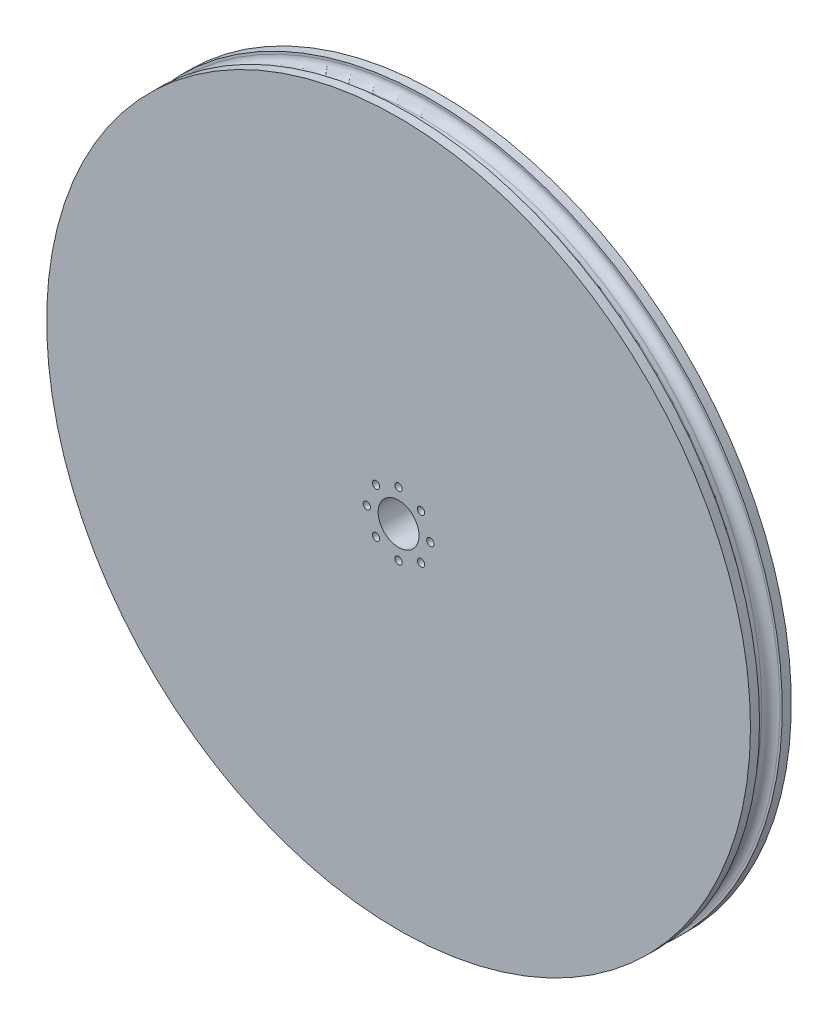
ISO-10303-21;
HEADER;
FILE_DESCRIPTION(('STEP AP214'),'2;1');
FILE_NAME('part.step','',(''),(''),'','','');
FILE_SCHEMA(('AUTOMOTIVE_DESIGN { 1 0 10303 214 1 1 1 1 }'));
ENDSEC;
DATA;
#1=APPLICATION_CONTEXT('core data for automotive mechanical design processes');
#2=APPLICATION_PROTOCOL_DEFINITION('international standard','automotive_design',2000,#1);
#3=PRODUCT_CONTEXT('',#1,'mechanical');
#4=PRODUCT('Part','Part','',(#3));
#5=PRODUCT_RELATED_PRODUCT_CATEGORY('part','',(#4));
#6=PRODUCT_DEFINITION_FORMATION('','',#4);
#7=PRODUCT_DEFINITION_CONTEXT('part definition',#1,'design');
#8=PRODUCT_DEFINITION('design','',#6,#7);
#9=PRODUCT_DEFINITION_SHAPE('','',#8);
#10=(LENGTH_UNIT() NAMED_UNIT(*) SI_UNIT(.MILLI.,.METRE.));
#11=(NAMED_UNIT(*) PLANE_ANGLE_UNIT() SI_UNIT($,.RADIAN.));
#12=(NAMED_UNIT(*) SI_UNIT($,.STERADIAN.) SOLID_ANGLE_UNIT());
#13=UNCERTAINTY_MEASURE_WITH_UNIT(LENGTH_MEASURE(1.E-05),#10,'distance_accuracy_value','');
#14=(GEOMETRIC_REPRESENTATION_CONTEXT(3) GLOBAL_UNCERTAINTY_ASSIGNED_CONTEXT((#13)) GLOBAL_UNIT_ASSIGNED_CONTEXT((#10,
#11,#12)) REPRESENTATION_CONTEXT('',''));
#15=CARTESIAN_POINT('',(0.,0.,0.));
#16=DIRECTION('',(0.,0.,1.));
#17=DIRECTION('',(1.,0.,0.));
#18=AXIS2_PLACEMENT_3D('',#15,#16,#17);
#19=CARTESIAN_POINT('',(-4.94974746830586,4.9497474683058,7.));
#20=DIRECTION('',(0.,0.,-1.));
#21=DIRECTION('',(-1.,0.,0.));
#22=AXIS2_PLACEMENT_3D('',#19,#20,#21);
#23=CYLINDRICAL_SURFACE('',#22,0.799999999999999);
#24=CARTESIAN_POINT('',(-4.94974746830586,4.9497474683058,7.));
#25=DIRECTION('',(0.,0.,-1.));
#26=DIRECTION('',(-1.,0.,0.));
#27=AXIS2_PLACEMENT_3D('',#24,#25,#26);
#28=CIRCLE('',#27,0.799999999999999);
#29=CARTESIAN_POINT('',(-5.74974746830586,4.9497474683058,7.));
#30=VERTEX_POINT('',#29);
#31=EDGE_CURVE('E81',#30,#30,#28,.T.);
#32=ORIENTED_EDGE('',*,*,#31,.F.);
#33=EDGE_LOOP('',(#32));
#34=FACE_BOUND('',#33,.T.);
#35=CARTESIAN_POINT('',(-4.94974746830586,4.9497474683058,0.5));
#36=DIRECTION('',(0.,0.,-1.));
#37=DIRECTION('',(-1.,0.,0.));
#38=AXIS2_PLACEMENT_3D('',#35,#36,#37);
#39=CIRCLE('',#38,0.799999999999999);
#40=CARTESIAN_POINT('',(-5.74974746830586,4.9497474683058,0.5));
#41=VERTEX_POINT('',#40);
#42=EDGE_CURVE('E95',#41,#41,#39,.F.);
#43=ORIENTED_EDGE('',*,*,#42,.F.);
#44=EDGE_LOOP('',(#43));
#45=FACE_BOUND('',#44,.T.);
#46=ADVANCED_FACE('F33',(#34,#45),#23,.F.);
#47=CARTESIAN_POINT('',(-7.,0.,7.));
#48=DIRECTION('',(0.,0.,-1.));
#49=DIRECTION('',(-1.,0.,0.));
#50=AXIS2_PLACEMENT_3D('',#47,#48,#49);
#51=CYLINDRICAL_SURFACE('',#50,0.800000000000002);
#52=CARTESIAN_POINT('',(-7.,0.,7.));
#53=DIRECTION('',(0.,0.,-1.));
#54=DIRECTION('',(-1.,0.,0.));
#55=AXIS2_PLACEMENT_3D('',#52,#53,#54);
#56=CIRCLE('',#55,0.800000000000002);
#57=CARTESIAN_POINT('',(-7.8,0.,7.));
#58=VERTEX_POINT('',#57);
#59=EDGE_CURVE('E78',#58,#58,#56,.T.);
#60=ORIENTED_EDGE('',*,*,#59,.F.);
#61=EDGE_LOOP('',(#60));
#62=FACE_BOUND('',#61,.T.);
#63=CARTESIAN_POINT('',(-7.,0.,0.5));
#64=DIRECTION('',(0.,0.,-1.));
#65=DIRECTION('',(-1.,0.,0.));
#66=AXIS2_PLACEMENT_3D('',#63,#64,#65);
#67=CIRCLE('',#66,0.800000000000002);
#68=CARTESIAN_POINT('',(-7.8,0.,0.5));
#69=VERTEX_POINT('',#68);
#70=EDGE_CURVE('E100',#69,#69,#67,.F.);
#71=ORIENTED_EDGE('',*,*,#70,.F.);
#72=EDGE_LOOP('',(#71));
#73=FACE_BOUND('',#72,.T.);
#74=ADVANCED_FACE('F157',(#62,#73),#51,.F.);
#75=CARTESIAN_POINT('',(-4.94974746830579,-4.94974746830588,7.));
#76=DIRECTION('',(0.,0.,-1.));
#77=DIRECTION('',(-1.,0.,0.));
#78=AXIS2_PLACEMENT_3D('',#75,#76,#77);
#79=CYLINDRICAL_SURFACE('',#78,0.799999999999999);
#80=CARTESIAN_POINT('',(-4.94974746830579,-4.94974746830588,7.));
#81=DIRECTION('',(0.,0.,-1.));
#82=DIRECTION('',(-1.,0.,0.));
#83=AXIS2_PLACEMENT_3D('',#80,#81,#82);
#84=CIRCLE('',#83,0.799999999999999);
#85=CARTESIAN_POINT('',(-5.74974746830579,-4.94974746830588,7.));
#86=VERTEX_POINT('',#85);
#87=EDGE_CURVE('E74',#86,#86,#84,.T.);
#88=ORIENTED_EDGE('',*,*,#87,.F.);
#89=EDGE_LOOP('',(#88));
#90=FACE_BOUND('',#89,.T.);
#91=CARTESIAN_POINT('',(-4.94974746830579,-4.94974746830588,0.5));
#92=DIRECTION('',(0.,0.,-1.));
#93=DIRECTION('',(-1.,0.,0.));
#94=AXIS2_PLACEMENT_3D('',#91,#92,#93);
#95=CIRCLE('',#94,0.799999999999999);
#96=CARTESIAN_POINT('',(-5.74974746830579,-4.94974746830588,0.5));
#97=VERTEX_POINT('',#96);
#98=EDGE_CURVE('E103',#97,#97,#95,.F.);
#99=ORIENTED_EDGE('',*,*,#98,.F.);
#100=EDGE_LOOP('',(#99));
#101=FACE_BOUND('',#100,.T.);
#102=ADVANCED_FACE('F163',(#90,#101),#79,.F.);
#103=CARTESIAN_POINT('',(0.,-7.,7.));
#104=DIRECTION('',(0.,0.,-1.));
#105=DIRECTION('',(-1.,0.,0.));
#106=AXIS2_PLACEMENT_3D('',#103,#104,#105);
#107=CYLINDRICAL_SURFACE('',#106,0.8);
#108=CARTESIAN_POINT('',(0.,-7.,7.));
#109=DIRECTION('',(0.,0.,-1.));
#110=DIRECTION('',(-1.,0.,0.));
#111=AXIS2_PLACEMENT_3D('',#108,#109,#110);
#112=CIRCLE('',#111,0.8);
#113=CARTESIAN_POINT('',(-0.799999999999931,-7.,7.));
#114=VERTEX_POINT('',#113);
#115=EDGE_CURVE('E71',#114,#114,#112,.T.);
#116=ORIENTED_EDGE('',*,*,#115,.F.);
#117=EDGE_LOOP('',(#116));
#118=FACE_BOUND('',#117,.T.);
#119=CARTESIAN_POINT('',(0.,-7.,0.5));
#120=DIRECTION('',(0.,0.,-1.));
#121=DIRECTION('',(-1.,0.,0.));
#122=AXIS2_PLACEMENT_3D('',#119,#120,#121);
#123=CIRCLE('',#122,0.8);
#124=CARTESIAN_POINT('',(-0.799999999999931,-7.,0.5));
#125=VERTEX_POINT('',#124);
#126=EDGE_CURVE('E106',#125,#125,#123,.F.);
#127=ORIENTED_EDGE('',*,*,#126,.F.);
#128=EDGE_LOOP('',(#127));
#129=FACE_BOUND('',#128,.T.);
#130=ADVANCED_FACE('F174',(#118,#129),#107,.F.);
#131=CARTESIAN_POINT('',(4.94974746830583,4.94974746830584,7.));
#132=DIRECTION('',(0.,0.,-1.));
#133=DIRECTION('',(-1.,0.,0.));
#134=AXIS2_PLACEMENT_3D('',#131,#132,#133);
#135=CYLINDRICAL_SURFACE('',#134,0.800000000000002);
#136=CARTESIAN_POINT('',(4.94974746830583,4.94974746830584,7.));
#137=DIRECTION('',(0.,0.,-1.));
#138=DIRECTION('',(-1.,0.,0.));
#139=AXIS2_PLACEMENT_3D('',#136,#137,#138);
#140=CIRCLE('',#139,0.800000000000002);
#141=CARTESIAN_POINT('',(4.14974746830583,4.94974746830584,7.));
#142=VERTEX_POINT('',#141);
#143=EDGE_CURVE('E87',#142,#142,#140,.T.);
#144=ORIENTED_EDGE('',*,*,#143,.F.);
#145=EDGE_LOOP('',(#144));
#146=FACE_BOUND('',#145,.T.);
#147=CARTESIAN_POINT('',(4.94974746830583,4.94974746830584,0.5));
#148=DIRECTION('',(0.,0.,-1.));
#149=DIRECTION('',(-1.,0.,0.));
#150=AXIS2_PLACEMENT_3D('',#147,#148,#149);
#151=CIRCLE('',#150,0.800000000000002);
#152=CARTESIAN_POINT('',(4.14974746830583,4.94974746830584,0.5));
#153=VERTEX_POINT('',#152);
#154=EDGE_CURVE('E109',#153,#153,#151,.F.);
#155=ORIENTED_EDGE('',*,*,#154,.F.);
#156=EDGE_LOOP('',(#155));
#157=FACE_BOUND('',#156,.T.);
#158=ADVANCED_FACE('F177',(#146,#157),#135,.F.);
#159=CARTESIAN_POINT('',(0.,0.,7.));
#160=DIRECTION('',(0.,0.,-1.));
#161=DIRECTION('',(-1.,0.,0.));
#162=AXIS2_PLACEMENT_3D('',#159,#160,#161);
#163=CYLINDRICAL_SURFACE('',#162,4.5);
#164=CARTESIAN_POINT('',(0.,0.,7.));
#165=DIRECTION('',(0.,0.,-1.));
#166=DIRECTION('',(-1.,0.,0.));
#167=AXIS2_PLACEMENT_3D('',#164,#165,#166);
#168=CIRCLE('',#167,4.5);
#169=CARTESIAN_POINT('',(-4.5,0.,7.));
#170=VERTEX_POINT('',#169);
#171=EDGE_CURVE('E92',#170,#170,#168,.T.);
#172=ORIENTED_EDGE('',*,*,#171,.F.);
#173=EDGE_LOOP('',(#172));
#174=FACE_BOUND('',#173,.T.);
#175=CARTESIAN_POINT('',(0.,0.,0.5));
#176=DIRECTION('',(0.,0.,-1.));
#177=DIRECTION('',(-1.,0.,0.));
#178=AXIS2_PLACEMENT_3D('',#175,#176,#177);
#179=CIRCLE('',#178,4.5);
#180=CARTESIAN_POINT('',(-4.5,0.,0.5));
#181=VERTEX_POINT('',#180);
#182=EDGE_CURVE('E112',#181,#181,#179,.F.);
#183=ORIENTED_EDGE('',*,*,#182,.F.);
#184=EDGE_LOOP('',(#183));
#185=FACE_BOUND('',#184,.T.);
#186=ADVANCED_FACE('F182',(#174,#185),#163,.F.);
#187=CARTESIAN_POINT('',(7.,0.,7.));
#188=DIRECTION('',(0.,0.,-1.));
#189=DIRECTION('',(-1.,0.,0.));
#190=AXIS2_PLACEMENT_3D('',#187,#188,#189);
#191=CYLINDRICAL_SURFACE('',#190,0.8);
#192=CARTESIAN_POINT('',(7.,0.,7.));
#193=DIRECTION('',(0.,0.,-1.));
#194=DIRECTION('',(-1.,0.,0.));
#195=AXIS2_PLACEMENT_3D('',#192,#193,#194);
#196=CIRCLE('',#195,0.8);
#197=CARTESIAN_POINT('',(6.2,0.,7.));
#198=VERTEX_POINT('',#197);
#199=EDGE_CURVE('E84',#198,#198,#196,.T.);
#200=ORIENTED_EDGE('',*,*,#199,.F.);
#201=EDGE_LOOP('',(#200));
#202=FACE_BOUND('',#201,.T.);
#203=CARTESIAN_POINT('',(7.,0.,0.5));
#204=DIRECTION('',(0.,0.,-1.));
#205=DIRECTION('',(-1.,0.,0.));
#206=AXIS2_PLACEMENT_3D('',#203,#204,#205);
#207=CIRCLE('',#206,0.8);
#208=CARTESIAN_POINT('',(6.2,0.,0.5));
#209=VERTEX_POINT('',#208);
#210=EDGE_CURVE('E115',#209,#209,#207,.F.);
#211=ORIENTED_EDGE('',*,*,#210,.F.);
#212=EDGE_LOOP('',(#211));
#213=FACE_BOUND('',#212,.T.);
#214=ADVANCED_FACE('F169',(#202,#213),#191,.F.);
#215=CARTESIAN_POINT('',(4.94974746830589,-4.94974746830577,7.));
#216=DIRECTION('',(0.,0.,-1.));
#217=DIRECTION('',(-1.,0.,0.));
#218=AXIS2_PLACEMENT_3D('',#215,#216,#217);
#219=CYLINDRICAL_SURFACE('',#218,0.800000000000002);
#220=CARTESIAN_POINT('',(4.94974746830589,-4.94974746830577,7.));
#221=DIRECTION('',(0.,0.,-1.));
#222=DIRECTION('',(-1.,0.,0.));
#223=AXIS2_PLACEMENT_3D('',#220,#221,#222);
#224=CIRCLE('',#223,0.800000000000002);
#225=CARTESIAN_POINT('',(4.14974746830589,-4.94974746830577,7.));
#226=VERTEX_POINT('',#225);
#227=EDGE_CURVE('E75',#226,#226,#224,.T.);
#228=ORIENTED_EDGE('',*,*,#227,.F.);
#229=EDGE_LOOP('',(#228));
#230=FACE_BOUND('',#229,.T.);
#231=CARTESIAN_POINT('',(4.94974746830589,-4.94974746830577,0.5));
#232=DIRECTION('',(0.,0.,-1.));
#233=DIRECTION('',(-1.,0.,0.));
#234=AXIS2_PLACEMENT_3D('',#231,#232,#233);
#235=CIRCLE('',#234,0.800000000000002);
#236=CARTESIAN_POINT('',(4.14974746830589,-4.94974746830577,0.5));
#237=VERTEX_POINT('',#236);
#238=EDGE_CURVE('E57',#237,#237,#235,.F.);
#239=ORIENTED_EDGE('',*,*,#238,.F.);
#240=EDGE_LOOP('',(#239));
#241=FACE_BOUND('',#240,.T.);
#242=ADVANCED_FACE('F288',(#230,#241),#219,.F.);
#243=CARTESIAN_POINT('',(0.,7.,7.));
#244=DIRECTION('',(0.,0.,-1.));
#245=DIRECTION('',(-1.,0.,0.));
#246=AXIS2_PLACEMENT_3D('',#243,#244,#245);
#247=CYLINDRICAL_SURFACE('',#246,0.8);
#248=CARTESIAN_POINT('',(0.,7.,7.));
#249=DIRECTION('',(0.,0.,-1.));
#250=DIRECTION('',(-1.,0.,0.));
#251=AXIS2_PLACEMENT_3D('',#248,#249,#250);
#252=CIRCLE('',#251,0.8);
#253=CARTESIAN_POINT('',(-0.800000000000028,7.,7.));
#254=VERTEX_POINT('',#253);
#255=EDGE_CURVE('E68',#254,#254,#252,.T.);
#256=ORIENTED_EDGE('',*,*,#255,.F.);
#257=EDGE_LOOP('',(#256));
#258=FACE_BOUND('',#257,.T.);
#259=CARTESIAN_POINT('',(0.,7.,0.5));
#260=DIRECTION('',(0.,0.,-1.));
#261=DIRECTION('',(-1.,0.,0.));
#262=AXIS2_PLACEMENT_3D('',#259,#260,#261);
#263=CIRCLE('',#262,0.8);
#264=CARTESIAN_POINT('',(-0.800000000000028,7.,0.5));
#265=VERTEX_POINT('',#264);
#266=EDGE_CURVE('E54',#265,#265,#263,.F.);
#267=ORIENTED_EDGE('',*,*,#266,.F.);
#268=EDGE_LOOP('',(#267));
#269=FACE_BOUND('',#268,.T.);
#270=ADVANCED_FACE('F223',(#258,#269),#247,.F.);
#271=CARTESIAN_POINT('',(0.,0.,5.));
#272=DIRECTION('',(0.,0.,-1.));
#273=DIRECTION('',(-1.,0.,0.));
#274=AXIS2_PLACEMENT_3D('',#271,#272,#273);
#275=CYLINDRICAL_SURFACE('',#274,75.);
#276=CARTESIAN_POINT('',(0.,0.,2.));
#277=DIRECTION('',(0.,0.,-1.));
#278=DIRECTION('',(-1.,0.,0.));
#279=AXIS2_PLACEMENT_3D('',#276,#277,#278);
#280=CIRCLE('',#279,75.);
#281=CARTESIAN_POINT('',(-75.,0.,2.));
#282=VERTEX_POINT('',#281);
#283=EDGE_CURVE('E44',#282,#282,#280,.F.);
#284=ORIENTED_EDGE('',*,*,#283,.T.);
#285=EDGE_LOOP('',(#284));
#286=FACE_BOUND('',#285,.T.);
#287=CARTESIAN_POINT('',(0.,0.,3.));
#288=DIRECTION('',(0.,0.,1.));
#289=DIRECTION('',(1.,0.,0.));
#290=AXIS2_PLACEMENT_3D('',#287,#288,#289);
#291=CIRCLE('',#290,75.);
#292=CARTESIAN_POINT('',(75.,0.,3.));
#293=VERTEX_POINT('',#292);
#294=EDGE_CURVE('E48',#293,#293,#291,.F.);
#295=ORIENTED_EDGE('',*,*,#294,.T.);
#296=EDGE_LOOP('',(#295));
#297=FACE_BOUND('',#296,.T.);
#298=ADVANCED_FACE('F213',(#286,#297),#275,.T.);
#299=CARTESIAN_POINT('',(0.,0.,7.));
#300=DIRECTION('',(0.,0.,-1.));
#301=DIRECTION('',(-1.,0.,0.));
#302=AXIS2_PLACEMENT_3D('',#299,#300,#301);
#303=CYLINDRICAL_SURFACE('',#302,77.5);
#304=CARTESIAN_POINT('',(0.,0.,7.));
#305=DIRECTION('',(0.,0.,1.));
#306=DIRECTION('',(1.,0.,0.));
#307=AXIS2_PLACEMENT_3D('',#304,#305,#306);
#308=CIRCLE('',#307,77.5);
#309=CARTESIAN_POINT('',(77.5,0.,7.));
#310=VERTEX_POINT('',#309);
#311=EDGE_CURVE('E53',#310,#310,#308,.T.);
#312=ORIENTED_EDGE('',*,*,#311,.F.);
#313=EDGE_LOOP('',(#312));
#314=FACE_BOUND('',#313,.T.);
#315=CARTESIAN_POINT('',(0.,0.,5.));
#316=DIRECTION('',(0.,0.,1.));
#317=DIRECTION('',(1.,0.,0.));
#318=AXIS2_PLACEMENT_3D('',#315,#316,#317);
#319=CIRCLE('',#318,77.5);
#320=CARTESIAN_POINT('',(77.5,0.,5.));
#321=VERTEX_POINT('',#320);
#322=EDGE_CURVE('E59',#321,#321,#319,.T.);
#323=ORIENTED_EDGE('',*,*,#322,.T.);
#324=EDGE_LOOP('',(#323));
#325=FACE_BOUND('',#324,.T.);
#326=ADVANCED_FACE('F201',(#314,#325),#303,.T.);
#327=CARTESIAN_POINT('',(0.,0.,7.));
#328=DIRECTION('',(0.,0.,1.));
#329=DIRECTION('',(1.,0.,0.));
#330=AXIS2_PLACEMENT_3D('',#327,#328,#329);
#331=PLANE('',#330);
#332=ORIENTED_EDGE('',*,*,#255,.T.);
#333=EDGE_LOOP('',(#332));
#334=FACE_BOUND('',#333,.T.);
#335=ORIENTED_EDGE('',*,*,#227,.T.);
#336=EDGE_LOOP('',(#335));
#337=FACE_BOUND('',#336,.T.);
#338=ORIENTED_EDGE('',*,*,#199,.T.);
#339=EDGE_LOOP('',(#338));
#340=FACE_BOUND('',#339,.T.);
#341=ORIENTED_EDGE('',*,*,#171,.T.);
#342=EDGE_LOOP('',(#341));
#343=FACE_BOUND('',#342,.T.);
#344=ORIENTED_EDGE('',*,*,#143,.T.);
#345=EDGE_LOOP('',(#344));
#346=FACE_BOUND('',#345,.T.);
#347=ORIENTED_EDGE('',*,*,#115,.T.);
#348=EDGE_LOOP('',(#347));
#349=FACE_BOUND('',#348,.T.);
#350=ORIENTED_EDGE('',*,*,#87,.T.);
#351=EDGE_LOOP('',(#350));
#352=FACE_BOUND('',#351,.T.);
#353=ORIENTED_EDGE('',*,*,#59,.T.);
#354=EDGE_LOOP('',(#353));
#355=FACE_BOUND('',#354,.T.);
#356=ORIENTED_EDGE('',*,*,#31,.T.);
#357=EDGE_LOOP('',(#356));
#358=FACE_BOUND('',#357,.T.);
#359=ORIENTED_EDGE('',*,*,#311,.T.);
#360=EDGE_LOOP('',(#359));
#361=FACE_BOUND('',#360,.T.);
#362=ADVANCED_FACE('F198',(#334,#337,#340,#343,#346,#349,#352,#355,#358,#361),#331,.T.);
#363=CARTESIAN_POINT('',(0.,0.,5.));
#364=DIRECTION('',(0.,0.,1.));
#365=DIRECTION('',(1.,0.,0.));
#366=AXIS2_PLACEMENT_3D('',#363,#364,#365);
#367=PLANE('',#366);
#368=CARTESIAN_POINT('',(0.,0.,5.));
#369=DIRECTION('',(0.,0.,1.));
#370=DIRECTION('',(1.,0.,0.));
#371=AXIS2_PLACEMENT_3D('',#368,#369,#370);
#372=CIRCLE('',#371,77.);
#373=CARTESIAN_POINT('',(77.,0.,5.));
#374=VERTEX_POINT('',#373);
#375=EDGE_CURVE('E10',#374,#374,#372,.T.);
#376=ORIENTED_EDGE('',*,*,#375,.T.);
#377=EDGE_LOOP('',(#376));
#378=FACE_BOUND('',#377,.T.);
#379=ORIENTED_EDGE('',*,*,#322,.F.);
#380=EDGE_LOOP('',(#379));
#381=FACE_BOUND('',#380,.T.);
#382=ADVANCED_FACE('F146',(#378,#381),#367,.F.);
#383=CARTESIAN_POINT('',(0.,0.,-2.));
#384=DIRECTION('',(0.,0.,1.));
#385=DIRECTION('',(1.,0.,0.));
#386=AXIS2_PLACEMENT_3D('',#383,#384,#385);
#387=CYLINDRICAL_SURFACE('',#386,77.5);
#388=CARTESIAN_POINT('',(0.,0.,-2.));
#389=DIRECTION('',(0.,0.,-1.));
#390=DIRECTION('',(-1.,0.,0.));
#391=AXIS2_PLACEMENT_3D('',#388,#389,#390);
#392=CIRCLE('',#391,77.5);
#393=CARTESIAN_POINT('',(-77.5,0.,-2.));
#394=VERTEX_POINT('',#393);
#395=EDGE_CURVE('E62',#394,#394,#392,.T.);
#396=ORIENTED_EDGE('',*,*,#395,.F.);
#397=EDGE_LOOP('',(#396));
#398=FACE_BOUND('',#397,.T.);
#399=CARTESIAN_POINT('',(0.,0.,0.));
#400=DIRECTION('',(0.,0.,-1.));
#401=DIRECTION('',(-1.,0.,0.));
#402=AXIS2_PLACEMENT_3D('',#399,#400,#401);
#403=CIRCLE('',#402,77.5);
#404=CARTESIAN_POINT('',(-77.5,0.,0.));
#405=VERTEX_POINT('',#404);
#406=EDGE_CURVE('E65',#405,#405,#403,.T.);
#407=ORIENTED_EDGE('',*,*,#406,.T.);
#408=EDGE_LOOP('',(#407));
#409=FACE_BOUND('',#408,.T.);
#410=ADVANCED_FACE('F140',(#398,#409),#387,.T.);
#411=CARTESIAN_POINT('',(0.,0.,-2.));
#412=DIRECTION('',(0.,0.,-1.));
#413=DIRECTION('',(-1.,0.,0.));
#414=AXIS2_PLACEMENT_3D('',#411,#412,#413);
#415=PLANE('',#414);
#416=CARTESIAN_POINT('',(0.,0.,-2.));
#417=DIRECTION('',(0.,0.,-1.));
#418=DIRECTION('',(-1.,0.,0.));
#419=AXIS2_PLACEMENT_3D('',#416,#417,#418);
#420=CIRCLE('',#419,10.);
#421=CARTESIAN_POINT('',(-10.,0.,-2.));
#422=VERTEX_POINT('',#421);
#423=EDGE_CURVE('E120',#422,#422,#420,.T.);
#424=ORIENTED_EDGE('',*,*,#423,.F.);
#425=EDGE_LOOP('',(#424));
#426=FACE_BOUND('',#425,.T.);
#427=ORIENTED_EDGE('',*,*,#395,.T.);
#428=EDGE_LOOP('',(#427));
#429=FACE_BOUND('',#428,.T.);
#430=ADVANCED_FACE('F136',(#426,#429),#415,.T.);
#431=CARTESIAN_POINT('',(0.,0.,0.));
#432=DIRECTION('',(0.,0.,-1.));
#433=DIRECTION('',(-1.,0.,0.));
#434=AXIS2_PLACEMENT_3D('',#431,#432,#433);
#435=PLANE('',#434);
#436=CARTESIAN_POINT('',(0.,0.,0.));
#437=DIRECTION('',(0.,0.,-1.));
#438=DIRECTION('',(-1.,0.,0.));
#439=AXIS2_PLACEMENT_3D('',#436,#437,#438);
#440=CIRCLE('',#439,77.);
#441=CARTESIAN_POINT('',(-77.,0.,0.));
#442=VERTEX_POINT('',#441);
#443=EDGE_CURVE('E40',#442,#442,#440,.T.);
#444=ORIENTED_EDGE('',*,*,#443,.T.);
#445=EDGE_LOOP('',(#444));
#446=FACE_BOUND('',#445,.T.);
#447=ORIENTED_EDGE('',*,*,#406,.F.);
#448=EDGE_LOOP('',(#447));
#449=FACE_BOUND('',#448,.T.);
#450=ADVANCED_FACE('F139',(#446,#449),#435,.F.);
#451=CARTESIAN_POINT('',(0.,0.,0.5));
#452=DIRECTION('',(0.,0.,-1.));
#453=DIRECTION('',(-1.,0.,0.));
#454=AXIS2_PLACEMENT_3D('',#451,#452,#453);
#455=PLANE('',#454);
#456=CARTESIAN_POINT('',(0.,0.,0.5));
#457=DIRECTION('',(0.,0.,-1.));
#458=DIRECTION('',(-1.,0.,0.));
#459=AXIS2_PLACEMENT_3D('',#456,#457,#458);
#460=CIRCLE('',#459,10.);
#461=CARTESIAN_POINT('',(-10.,0.,0.5));
#462=VERTEX_POINT('',#461);
#463=EDGE_CURVE('E58',#462,#462,#460,.T.);
#464=ORIENTED_EDGE('',*,*,#463,.T.);
#465=EDGE_LOOP('',(#464));
#466=FACE_BOUND('',#465,.T.);
#467=ORIENTED_EDGE('',*,*,#266,.T.);
#468=EDGE_LOOP('',(#467));
#469=FACE_BOUND('',#468,.T.);
#470=ORIENTED_EDGE('',*,*,#238,.T.);
#471=EDGE_LOOP('',(#470));
#472=FACE_BOUND('',#471,.T.);
#473=ORIENTED_EDGE('',*,*,#210,.T.);
#474=EDGE_LOOP('',(#473));
#475=FACE_BOUND('',#474,.T.);
#476=ORIENTED_EDGE('',*,*,#182,.T.);
#477=EDGE_LOOP('',(#476));
#478=FACE_BOUND('',#477,.T.);
#479=ORIENTED_EDGE('',*,*,#154,.T.);
#480=EDGE_LOOP('',(#479));
#481=FACE_BOUND('',#480,.T.);
#482=ORIENTED_EDGE('',*,*,#126,.T.);
#483=EDGE_LOOP('',(#482));
#484=FACE_BOUND('',#483,.T.);
#485=ORIENTED_EDGE('',*,*,#98,.T.);
#486=EDGE_LOOP('',(#485));
#487=FACE_BOUND('',#486,.T.);
#488=ORIENTED_EDGE('',*,*,#70,.T.);
#489=EDGE_LOOP('',(#488));
#490=FACE_BOUND('',#489,.T.);
#491=ORIENTED_EDGE('',*,*,#42,.T.);
#492=EDGE_LOOP('',(#491));
#493=FACE_BOUND('',#492,.T.);
#494=ADVANCED_FACE('F126',(#466,#469,#472,#475,#478,#481,#484,#487,#490,#493),#455,.T.);
#495=CARTESIAN_POINT('',(0.,0.,0.5));
#496=DIRECTION('',(0.,0.,-1.));
#497=DIRECTION('',(-1.,0.,0.));
#498=AXIS2_PLACEMENT_3D('',#495,#496,#497);
#499=CYLINDRICAL_SURFACE('',#498,10.);
#500=ORIENTED_EDGE('',*,*,#463,.F.);
#501=EDGE_LOOP('',(#500));
#502=FACE_BOUND('',#501,.T.);
#503=ORIENTED_EDGE('',*,*,#423,.T.);
#504=EDGE_LOOP('',(#503));
#505=FACE_BOUND('',#504,.T.);
#506=ADVANCED_FACE('F129',(#502,#505),#499,.F.);
#507=CARTESIAN_POINT('',(0.,0.,2.));
#508=DIRECTION('',(0.,0.,-1.));
#509=DIRECTION('',(-1.,0.,0.));
#510=AXIS2_PLACEMENT_3D('',#507,#508,#509);
#511=TOROIDAL_SURFACE('',#510,77.,2.);
#512=ORIENTED_EDGE('',*,*,#443,.F.);
#513=EDGE_LOOP('',(#512));
#514=FACE_BOUND('',#513,.T.);
#515=ORIENTED_EDGE('',*,*,#283,.F.);
#516=EDGE_LOOP('',(#515));
#517=FACE_BOUND('',#516,.T.);
#518=ADVANCED_FACE('F132',(#514,#517),#511,.F.);
#519=CARTESIAN_POINT('',(0.,0.,3.));
#520=DIRECTION('',(0.,0.,1.));
#521=DIRECTION('',(1.,0.,0.));
#522=AXIS2_PLACEMENT_3D('',#519,#520,#521);
#523=TOROIDAL_SURFACE('',#522,77.,2.);
#524=ORIENTED_EDGE('',*,*,#294,.F.);
#525=EDGE_LOOP('',(#524));
#526=FACE_BOUND('',#525,.T.);
#527=ORIENTED_EDGE('',*,*,#375,.F.);
#528=EDGE_LOOP('',(#527));
#529=FACE_BOUND('',#528,.T.);
#530=ADVANCED_FACE('F35',(#526,#529),#523,.F.);
#531=CLOSED_SHELL('',(#46,#74,#102,#130,#158,#186,#214,#242,#270,#298,#326,#362,#382,#410,#430,
#450,#494,#506,#518,#530));
#532=MANIFOLD_SOLID_BREP('B2',#531);
#533=ADVANCED_BREP_SHAPE_REPRESENTATION('',(#18,#532),#14);
#534=SHAPE_DEFINITION_REPRESENTATION(#9,#533);
ENDSEC;
END-ISO-10303-21;
